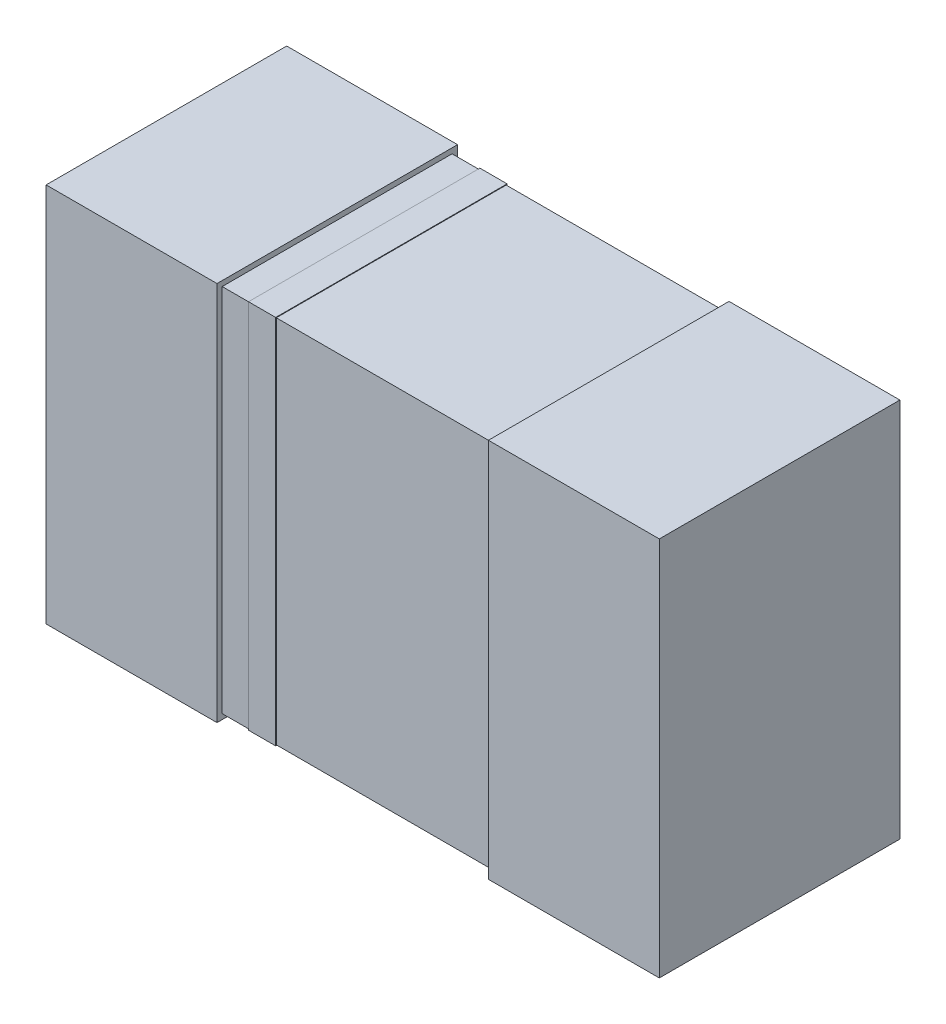
ISO-10303-21;
HEADER;
FILE_DESCRIPTION(('STEP AP214'),'2;1');
FILE_NAME('part.step','',(''),(''),'','','');
FILE_SCHEMA(('AUTOMOTIVE_DESIGN { 1 0 10303 214 1 1 1 1 }'));
ENDSEC;
DATA;
#1=APPLICATION_CONTEXT('core data for automotive mechanical design processes');
#2=APPLICATION_PROTOCOL_DEFINITION('international standard','automotive_design',2000,#1);
#3=PRODUCT_CONTEXT('',#1,'mechanical');
#4=PRODUCT('Part','Part','',(#3));
#5=PRODUCT_RELATED_PRODUCT_CATEGORY('part','',(#4));
#6=PRODUCT_DEFINITION_FORMATION('','',#4);
#7=PRODUCT_DEFINITION_CONTEXT('part definition',#1,'design');
#8=PRODUCT_DEFINITION('design','',#6,#7);
#9=PRODUCT_DEFINITION_SHAPE('','',#8);
#10=(LENGTH_UNIT() NAMED_UNIT(*) SI_UNIT(.MILLI.,.METRE.));
#11=(NAMED_UNIT(*) PLANE_ANGLE_UNIT() SI_UNIT($,.RADIAN.));
#12=(NAMED_UNIT(*) SI_UNIT($,.STERADIAN.) SOLID_ANGLE_UNIT());
#13=UNCERTAINTY_MEASURE_WITH_UNIT(LENGTH_MEASURE(1.E-05),#10,'distance_accuracy_value','');
#14=(GEOMETRIC_REPRESENTATION_CONTEXT(3) GLOBAL_UNCERTAINTY_ASSIGNED_CONTEXT((#13)) GLOBAL_UNIT_ASSIGNED_CONTEXT((#10,
#11,#12)) REPRESENTATION_CONTEXT('',''));
#15=CARTESIAN_POINT('',(0.,0.,0.));
#16=DIRECTION('',(0.,0.,1.));
#17=DIRECTION('',(1.,0.,0.));
#18=AXIS2_PLACEMENT_3D('',#15,#16,#17);
#19=CARTESIAN_POINT('',(0.444,0.622,0.));
#20=DIRECTION('',(-1.,0.,0.));
#21=DIRECTION('',(0.,0.,1.));
#22=AXIS2_PLACEMENT_3D('',#19,#20,#21);
#23=PLANE('',#22);
#24=DIRECTION('',(0.,1.,0.));
#25=VECTOR('',#24,1.);
#26=CARTESIAN_POINT('',(0.444,-0.622,0.787));
#27=LINE('',#26,#25);
#28=CARTESIAN_POINT('',(0.444,0.622,0.787));
#29=VERTEX_POINT('',#28);
#30=CARTESIAN_POINT('',(0.444,-0.622,0.787));
#31=VERTEX_POINT('',#30);
#32=EDGE_CURVE('P0_E68',#29,#31,#27,.F.);
#33=ORIENTED_EDGE('',*,*,#32,.F.);
#34=DIRECTION('',(0.,0.,1.));
#35=VECTOR('',#34,1.);
#36=CARTESIAN_POINT('',(0.444,0.622,0.));
#37=LINE('',#36,#35);
#38=CARTESIAN_POINT('',(0.444,0.622,0.));
#39=VERTEX_POINT('',#38);
#40=EDGE_CURVE('P0_E55',#39,#29,#37,.T.);
#41=ORIENTED_EDGE('',*,*,#40,.F.);
#42=DIRECTION('',(0.,1.,0.));
#43=VECTOR('',#42,1.);
#44=CARTESIAN_POINT('',(0.444,0.622,0.));
#45=LINE('',#44,#43);
#46=CARTESIAN_POINT('',(0.444,-0.622,0.));
#47=VERTEX_POINT('',#46);
#48=EDGE_CURVE('P0_E20',#47,#39,#45,.T.);
#49=ORIENTED_EDGE('',*,*,#48,.F.);
#50=DIRECTION('',(0.,0.,-1.));
#51=VECTOR('',#50,1.);
#52=CARTESIAN_POINT('',(0.444,-0.622,0.));
#53=LINE('',#52,#51);
#54=EDGE_CURVE('P0_E81',#31,#47,#53,.T.);
#55=ORIENTED_EDGE('',*,*,#54,.F.);
#56=EDGE_LOOP('',(#33,#41,#49,#55));
#57=FACE_BOUND('',#56,.T.);
#58=ADVANCED_FACE('P0_F17',(#57),#23,.T.);
#59=CARTESIAN_POINT('',(0.444,0.622,0.));
#60=DIRECTION('',(0.,0.,-1.));
#61=DIRECTION('',(-1.,0.,0.));
#62=AXIS2_PLACEMENT_3D('',#59,#60,#61);
#63=PLANE('',#62);
#64=DIRECTION('',(1.,0.,0.));
#65=VECTOR('',#64,1.);
#66=CARTESIAN_POINT('',(0.444,-0.622,0.));
#67=LINE('',#66,#65);
#68=CARTESIAN_POINT('',(1.003,-0.622,0.));
#69=VERTEX_POINT('',#68);
#70=EDGE_CURVE('P0_E64',#47,#69,#67,.T.);
#71=ORIENTED_EDGE('',*,*,#70,.F.);
#72=ORIENTED_EDGE('',*,*,#48,.T.);
#73=DIRECTION('',(1.,0.,0.));
#74=VECTOR('',#73,1.);
#75=CARTESIAN_POINT('',(1.003,0.622,0.));
#76=LINE('',#75,#74);
#77=CARTESIAN_POINT('',(1.003,0.622,0.));
#78=VERTEX_POINT('',#77);
#79=EDGE_CURVE('P0_E61',#78,#39,#76,.F.);
#80=ORIENTED_EDGE('',*,*,#79,.F.);
#81=DIRECTION('',(0.,1.,0.));
#82=VECTOR('',#81,1.);
#83=CARTESIAN_POINT('',(1.003,-0.622,0.));
#84=LINE('',#83,#82);
#85=EDGE_CURVE('P0_E83',#69,#78,#84,.T.);
#86=ORIENTED_EDGE('',*,*,#85,.F.);
#87=EDGE_LOOP('',(#71,#72,#80,#86));
#88=FACE_BOUND('',#87,.T.);
#89=ADVANCED_FACE('P0_F60',(#88),#63,.T.);
#90=CARTESIAN_POINT('',(1.003,0.622,0.));
#91=DIRECTION('',(0.,1.,0.));
#92=DIRECTION('',(0.,0.,1.));
#93=AXIS2_PLACEMENT_3D('',#90,#91,#92);
#94=PLANE('',#93);
#95=DIRECTION('',(1.,0.,0.));
#96=VECTOR('',#95,1.);
#97=CARTESIAN_POINT('',(0.444,0.622,0.787));
#98=LINE('',#97,#96);
#99=CARTESIAN_POINT('',(1.003,0.622,0.787));
#100=VERTEX_POINT('',#99);
#101=EDGE_CURVE('P0_E70',#100,#29,#98,.F.);
#102=ORIENTED_EDGE('',*,*,#101,.F.);
#103=DIRECTION('',(0.,0.,-1.));
#104=VECTOR('',#103,1.);
#105=CARTESIAN_POINT('',(1.003,0.622,0.));
#106=LINE('',#105,#104);
#107=EDGE_CURVE('P0_E74',#78,#100,#106,.F.);
#108=ORIENTED_EDGE('',*,*,#107,.F.);
#109=ORIENTED_EDGE('',*,*,#79,.T.);
#110=ORIENTED_EDGE('',*,*,#40,.T.);
#111=EDGE_LOOP('',(#102,#108,#109,#110));
#112=FACE_BOUND('',#111,.T.);
#113=ADVANCED_FACE('P0_F72',(#112),#94,.T.);
#114=CARTESIAN_POINT('',(0.444,-0.622,0.787));
#115=DIRECTION('',(0.,0.,1.));
#116=DIRECTION('',(1.,0.,0.));
#117=AXIS2_PLACEMENT_3D('',#114,#115,#116);
#118=PLANE('',#117);
#119=ORIENTED_EDGE('',*,*,#101,.T.);
#120=ORIENTED_EDGE('',*,*,#32,.T.);
#121=DIRECTION('',(1.,0.,0.));
#122=VECTOR('',#121,1.);
#123=CARTESIAN_POINT('',(0.444,-0.622,0.787));
#124=LINE('',#123,#122);
#125=CARTESIAN_POINT('',(1.003,-0.622,0.787));
#126=VERTEX_POINT('',#125);
#127=EDGE_CURVE('P0_E35',#126,#31,#124,.F.);
#128=ORIENTED_EDGE('',*,*,#127,.F.);
#129=DIRECTION('',(0.,1.,0.));
#130=VECTOR('',#129,1.);
#131=CARTESIAN_POINT('',(1.003,-0.622,0.787));
#132=LINE('',#131,#130);
#133=EDGE_CURVE('P0_E26',#100,#126,#132,.F.);
#134=ORIENTED_EDGE('',*,*,#133,.F.);
#135=EDGE_LOOP('',(#119,#120,#128,#134));
#136=FACE_BOUND('',#135,.T.);
#137=ADVANCED_FACE('P0_F89',(#136),#118,.T.);
#138=CARTESIAN_POINT('',(0.444,-0.622,0.));
#139=DIRECTION('',(0.,-1.,0.));
#140=DIRECTION('',(0.,0.,-1.));
#141=AXIS2_PLACEMENT_3D('',#138,#139,#140);
#142=PLANE('',#141);
#143=ORIENTED_EDGE('',*,*,#127,.T.);
#144=ORIENTED_EDGE('',*,*,#54,.T.);
#145=ORIENTED_EDGE('',*,*,#70,.T.);
#146=DIRECTION('',(0.,0.,-1.));
#147=VECTOR('',#146,1.);
#148=CARTESIAN_POINT('',(1.003,-0.622,0.));
#149=LINE('',#148,#147);
#150=EDGE_CURVE('P0_E11',#126,#69,#149,.T.);
#151=ORIENTED_EDGE('',*,*,#150,.F.);
#152=EDGE_LOOP('',(#143,#144,#145,#151));
#153=FACE_BOUND('',#152,.T.);
#154=ADVANCED_FACE('P0_F91',(#153),#142,.T.);
#155=CARTESIAN_POINT('',(1.003,-0.622,0.));
#156=DIRECTION('',(1.,0.,0.));
#157=DIRECTION('',(0.,0.,-1.));
#158=AXIS2_PLACEMENT_3D('',#155,#156,#157);
#159=PLANE('',#158);
#160=ORIENTED_EDGE('',*,*,#133,.T.);
#161=ORIENTED_EDGE('',*,*,#150,.T.);
#162=ORIENTED_EDGE('',*,*,#85,.T.);
#163=ORIENTED_EDGE('',*,*,#107,.T.);
#164=EDGE_LOOP('',(#160,#161,#162,#163));
#165=FACE_BOUND('',#164,.T.);
#166=ADVANCED_FACE('P0_F88',(#165),#159,.T.);
#167=CLOSED_SHELL('',(#58,#89,#113,#137,#154,#166));
#168=MANIFOLD_SOLID_BREP('P0_B1',#167);
#169=CARTESIAN_POINT('',(-0.267,-0.605,0.77));
#170=DIRECTION('',(0.,0.,-1.));
#171=DIRECTION('',(-1.,0.,0.));
#172=AXIS2_PLACEMENT_3D('',#169,#170,#171);
#173=PLANE('',#172);
#174=DIRECTION('',(1.,0.,0.));
#175=VECTOR('',#174,1.);
#176=CARTESIAN_POINT('',(-0.356,0.605,0.77));
#177=LINE('',#176,#175);
#178=CARTESIAN_POINT('',(-0.267,0.605,0.77));
#179=VERTEX_POINT('',#178);
#180=CARTESIAN_POINT('',(-0.356,0.605,0.77));
#181=VERTEX_POINT('',#180);
#182=EDGE_CURVE('P1_E92',#179,#181,#177,.F.);
#183=ORIENTED_EDGE('',*,*,#182,.F.);
#184=DIRECTION('',(0.,1.,0.));
#185=VECTOR('',#184,1.);
#186=CARTESIAN_POINT('',(-0.267,-0.607,0.77));
#187=LINE('',#186,#185);
#188=CARTESIAN_POINT('',(-0.267,-0.605,0.77));
#189=VERTEX_POINT('',#188);
#190=EDGE_CURVE('P1_E90',#189,#179,#187,.T.);
#191=ORIENTED_EDGE('',*,*,#190,.F.);
#192=DIRECTION('',(1.,0.,0.));
#193=VECTOR('',#192,1.);
#194=CARTESIAN_POINT('',(-0.267,-0.605,0.77));
#195=LINE('',#194,#193);
#196=CARTESIAN_POINT('',(-0.356,-0.605,0.77));
#197=VERTEX_POINT('',#196);
#198=EDGE_CURVE('P1_E20',#197,#189,#195,.T.);
#199=ORIENTED_EDGE('',*,*,#198,.F.);
#200=DIRECTION('',(0.,1.,0.));
#201=VECTOR('',#200,1.);
#202=CARTESIAN_POINT('',(-0.356,-0.605,0.77));
#203=LINE('',#202,#201);
#204=EDGE_CURVE('P1_E113',#181,#197,#203,.F.);
#205=ORIENTED_EDGE('',*,*,#204,.F.);
#206=EDGE_LOOP('',(#183,#191,#199,#205));
#207=FACE_BOUND('',#206,.T.);
#208=ADVANCED_FACE('P1_F17',(#207),#173,.T.);
#209=CARTESIAN_POINT('',(-0.267,-0.605,0.018));
#210=DIRECTION('',(0.,1.,0.));
#211=DIRECTION('',(0.,0.,1.));
#212=AXIS2_PLACEMENT_3D('',#209,#210,#211);
#213=PLANE('',#212);
#214=ORIENTED_EDGE('',*,*,#198,.T.);
#215=DIRECTION('',(0.,0.,-1.));
#216=VECTOR('',#215,1.);
#217=CARTESIAN_POINT('',(-0.267,-0.605,0.015));
#218=LINE('',#217,#216);
#219=CARTESIAN_POINT('',(-0.267,-0.605,0.018));
#220=VERTEX_POINT('',#219);
#221=EDGE_CURVE('P1_E84',#220,#189,#218,.F.);
#222=ORIENTED_EDGE('',*,*,#221,.F.);
#223=DIRECTION('',(1.,0.,0.));
#224=VECTOR('',#223,1.);
#225=CARTESIAN_POINT('',(-0.356,-0.605,0.018));
#226=LINE('',#225,#224);
#227=CARTESIAN_POINT('',(-0.356,-0.605,0.018));
#228=VERTEX_POINT('',#227);
#229=EDGE_CURVE('P1_E105',#228,#220,#226,.T.);
#230=ORIENTED_EDGE('',*,*,#229,.F.);
#231=DIRECTION('',(0.,0.,1.));
#232=VECTOR('',#231,1.);
#233=CARTESIAN_POINT('',(-0.356,-0.605,0.018));
#234=LINE('',#233,#232);
#235=EDGE_CURVE('P1_E87',#197,#228,#234,.F.);
#236=ORIENTED_EDGE('',*,*,#235,.F.);
#237=EDGE_LOOP('',(#214,#222,#230,#236));
#238=FACE_BOUND('',#237,.T.);
#239=ADVANCED_FACE('P1_F82',(#238),#213,.T.);
#240=CARTESIAN_POINT('',(-0.356,-0.607,0.772));
#241=DIRECTION('',(0.,0.,1.));
#242=DIRECTION('',(1.,0.,0.));
#243=AXIS2_PLACEMENT_3D('',#240,#241,#242);
#244=PLANE('',#243);
#245=DIRECTION('',(1.,0.,0.));
#246=VECTOR('',#245,1.);
#247=CARTESIAN_POINT('',(-0.267,0.607,0.772));
#248=LINE('',#247,#246);
#249=CARTESIAN_POINT('',(-0.356,0.607,0.772));
#250=VERTEX_POINT('',#249);
#251=CARTESIAN_POINT('',(-0.267,0.607,0.772));
#252=VERTEX_POINT('',#251);
#253=EDGE_CURVE('P1_E116',#250,#252,#248,.T.);
#254=ORIENTED_EDGE('',*,*,#253,.F.);
#255=DIRECTION('',(0.,1.,0.));
#256=VECTOR('',#255,1.);
#257=CARTESIAN_POINT('',(-0.356,-0.605,0.772));
#258=LINE('',#257,#256);
#259=CARTESIAN_POINT('',(-0.356,-0.607,0.772));
#260=VERTEX_POINT('',#259);
#261=EDGE_CURVE('P1_E110',#260,#250,#258,.T.);
#262=ORIENTED_EDGE('',*,*,#261,.F.);
#263=DIRECTION('',(1.,0.,0.));
#264=VECTOR('',#263,1.);
#265=CARTESIAN_POINT('',(-0.356,-0.607,0.772));
#266=LINE('',#265,#264);
#267=CARTESIAN_POINT('',(-0.267,-0.607,0.772));
#268=VERTEX_POINT('',#267);
#269=EDGE_CURVE('P1_E128',#268,#260,#266,.F.);
#270=ORIENTED_EDGE('',*,*,#269,.F.);
#271=DIRECTION('',(0.,1.,0.));
#272=VECTOR('',#271,1.);
#273=CARTESIAN_POINT('',(-0.267,-0.607,0.772));
#274=LINE('',#273,#272);
#275=EDGE_CURVE('P1_E96',#268,#252,#274,.T.);
#276=ORIENTED_EDGE('',*,*,#275,.T.);
#277=EDGE_LOOP('',(#254,#262,#270,#276));
#278=FACE_BOUND('',#277,.T.);
#279=ADVANCED_FACE('P1_F153',(#278),#244,.T.);
#280=CARTESIAN_POINT('',(-0.356,-0.605,0.018));
#281=DIRECTION('',(0.,0.,1.));
#282=DIRECTION('',(1.,0.,0.));
#283=AXIS2_PLACEMENT_3D('',#280,#281,#282);
#284=PLANE('',#283);
#285=DIRECTION('',(1.,0.,0.));
#286=VECTOR('',#285,1.);
#287=CARTESIAN_POINT('',(-0.356,0.605,0.018));
#288=LINE('',#287,#286);
#289=CARTESIAN_POINT('',(-0.356,0.605,0.018));
#290=VERTEX_POINT('',#289);
#291=CARTESIAN_POINT('',(-0.267,0.605,0.018));
#292=VERTEX_POINT('',#291);
#293=EDGE_CURVE('P1_E107',#290,#292,#288,.T.);
#294=ORIENTED_EDGE('',*,*,#293,.F.);
#295=DIRECTION('',(0.,1.,0.));
#296=VECTOR('',#295,1.);
#297=CARTESIAN_POINT('',(-0.356,0.607,0.018));
#298=LINE('',#297,#296);
#299=EDGE_CURVE('P1_E131',#228,#290,#298,.T.);
#300=ORIENTED_EDGE('',*,*,#299,.F.);
#301=ORIENTED_EDGE('',*,*,#229,.T.);
#302=DIRECTION('',(0.,1.,0.));
#303=VECTOR('',#302,1.);
#304=CARTESIAN_POINT('',(-0.267,-0.607,0.018));
#305=LINE('',#304,#303);
#306=EDGE_CURVE('P1_E102',#292,#220,#305,.F.);
#307=ORIENTED_EDGE('',*,*,#306,.F.);
#308=EDGE_LOOP('',(#294,#300,#301,#307));
#309=FACE_BOUND('',#308,.T.);
#310=ADVANCED_FACE('P1_F168',(#309),#284,.T.);
#311=CARTESIAN_POINT('',(-0.356,0.605,0.018));
#312=DIRECTION('',(0.,-1.,0.));
#313=DIRECTION('',(0.,0.,-1.));
#314=AXIS2_PLACEMENT_3D('',#311,#312,#313);
#315=PLANE('',#314);
#316=ORIENTED_EDGE('',*,*,#182,.T.);
#317=DIRECTION('',(0.,0.,1.));
#318=VECTOR('',#317,1.);
#319=CARTESIAN_POINT('',(-0.356,0.605,0.015));
#320=LINE('',#319,#318);
#321=EDGE_CURVE('P1_E134',#290,#181,#320,.T.);
#322=ORIENTED_EDGE('',*,*,#321,.F.);
#323=ORIENTED_EDGE('',*,*,#293,.T.);
#324=DIRECTION('',(0.,0.,-1.));
#325=VECTOR('',#324,1.);
#326=CARTESIAN_POINT('',(-0.267,0.605,0.015));
#327=LINE('',#326,#325);
#328=EDGE_CURVE('P1_E122',#179,#292,#327,.T.);
#329=ORIENTED_EDGE('',*,*,#328,.F.);
#330=EDGE_LOOP('',(#316,#322,#323,#329));
#331=FACE_BOUND('',#330,.T.);
#332=ADVANCED_FACE('P1_F160',(#331),#315,.T.);
#333=CARTESIAN_POINT('',(-0.267,0.607,0.015));
#334=DIRECTION('',(0.,1.,0.));
#335=DIRECTION('',(0.,0.,1.));
#336=AXIS2_PLACEMENT_3D('',#333,#334,#335);
#337=PLANE('',#336);
#338=ORIENTED_EDGE('',*,*,#253,.T.);
#339=DIRECTION('',(0.,0.,-1.));
#340=VECTOR('',#339,1.);
#341=CARTESIAN_POINT('',(-0.267,0.607,0.015));
#342=LINE('',#341,#340);
#343=CARTESIAN_POINT('',(-0.267,0.607,0.015));
#344=VERTEX_POINT('',#343);
#345=EDGE_CURVE('P1_E119',#344,#252,#342,.F.);
#346=ORIENTED_EDGE('',*,*,#345,.F.);
#347=DIRECTION('',(-1.,0.,0.));
#348=VECTOR('',#347,1.);
#349=CARTESIAN_POINT('',(-0.356,0.607,0.015));
#350=LINE('',#349,#348);
#351=CARTESIAN_POINT('',(-0.356,0.607,0.015));
#352=VERTEX_POINT('',#351);
#353=EDGE_CURVE('P1_E140',#352,#344,#350,.F.);
#354=ORIENTED_EDGE('',*,*,#353,.F.);
#355=DIRECTION('',(0.,0.,1.));
#356=VECTOR('',#355,1.);
#357=CARTESIAN_POINT('',(-0.356,0.607,0.015));
#358=LINE('',#357,#356);
#359=EDGE_CURVE('P1_E137',#250,#352,#358,.F.);
#360=ORIENTED_EDGE('',*,*,#359,.F.);
#361=EDGE_LOOP('',(#338,#346,#354,#360));
#362=FACE_BOUND('',#361,.T.);
#363=ADVANCED_FACE('P1_F158',(#362),#337,.T.);
#364=CARTESIAN_POINT('',(-0.267,-0.607,0.015));
#365=DIRECTION('',(1.,0.,0.));
#366=DIRECTION('',(0.,0.,-1.));
#367=AXIS2_PLACEMENT_3D('',#364,#365,#366);
#368=PLANE('',#367);
#369=ORIENTED_EDGE('',*,*,#190,.T.);
#370=ORIENTED_EDGE('',*,*,#328,.T.);
#371=ORIENTED_EDGE('',*,*,#306,.T.);
#372=ORIENTED_EDGE('',*,*,#221,.T.);
#373=EDGE_LOOP('',(#369,#370,#371,#372));
#374=FACE_BOUND('',#373,.T.);
#375=ORIENTED_EDGE('',*,*,#345,.T.);
#376=ORIENTED_EDGE('',*,*,#275,.F.);
#377=DIRECTION('',(0.,0.,-1.));
#378=VECTOR('',#377,1.);
#379=CARTESIAN_POINT('',(-0.267,-0.607,0.015));
#380=LINE('',#379,#378);
#381=CARTESIAN_POINT('',(-0.267,-0.607,0.015));
#382=VERTEX_POINT('',#381);
#383=EDGE_CURVE('P1_E125',#382,#268,#380,.F.);
#384=ORIENTED_EDGE('',*,*,#383,.F.);
#385=DIRECTION('',(0.,1.,0.));
#386=VECTOR('',#385,1.);
#387=CARTESIAN_POINT('',(-0.267,0.607,0.015));
#388=LINE('',#387,#386);
#389=EDGE_CURVE('P1_E143',#344,#382,#388,.F.);
#390=ORIENTED_EDGE('',*,*,#389,.F.);
#391=EDGE_LOOP('',(#375,#376,#384,#390));
#392=FACE_BOUND('',#391,.T.);
#393=ADVANCED_FACE('P1_F99',(#374,#392),#368,.T.);
#394=CARTESIAN_POINT('',(-0.356,-0.607,0.015));
#395=DIRECTION('',(0.,-1.,0.));
#396=DIRECTION('',(0.,0.,-1.));
#397=AXIS2_PLACEMENT_3D('',#394,#395,#396);
#398=PLANE('',#397);
#399=ORIENTED_EDGE('',*,*,#269,.T.);
#400=DIRECTION('',(0.,0.,-1.));
#401=VECTOR('',#400,1.);
#402=CARTESIAN_POINT('',(-0.356,-0.607,0.015));
#403=LINE('',#402,#401);
#404=CARTESIAN_POINT('',(-0.356,-0.607,0.015));
#405=VERTEX_POINT('',#404);
#406=EDGE_CURVE('P1_E35',#260,#405,#403,.T.);
#407=ORIENTED_EDGE('',*,*,#406,.T.);
#408=DIRECTION('',(-1.,0.,0.));
#409=VECTOR('',#408,1.);
#410=CARTESIAN_POINT('',(-0.356,-0.607,0.015));
#411=LINE('',#410,#409);
#412=EDGE_CURVE('P1_E26',#382,#405,#411,.T.);
#413=ORIENTED_EDGE('',*,*,#412,.F.);
#414=ORIENTED_EDGE('',*,*,#383,.T.);
#415=EDGE_LOOP('',(#399,#407,#413,#414));
#416=FACE_BOUND('',#415,.T.);
#417=ADVANCED_FACE('P1_F150',(#416),#398,.T.);
#418=CARTESIAN_POINT('',(-0.356,0.607,0.015));
#419=DIRECTION('',(-1.,0.,0.));
#420=DIRECTION('',(0.,0.,1.));
#421=AXIS2_PLACEMENT_3D('',#418,#419,#420);
#422=PLANE('',#421);
#423=ORIENTED_EDGE('',*,*,#235,.T.);
#424=ORIENTED_EDGE('',*,*,#299,.T.);
#425=ORIENTED_EDGE('',*,*,#321,.T.);
#426=ORIENTED_EDGE('',*,*,#204,.T.);
#427=EDGE_LOOP('',(#423,#424,#425,#426));
#428=FACE_BOUND('',#427,.T.);
#429=DIRECTION('',(0.,1.,0.));
#430=VECTOR('',#429,1.);
#431=CARTESIAN_POINT('',(-0.356,0.607,0.015));
#432=LINE('',#431,#430);
#433=EDGE_CURVE('P1_E11',#405,#352,#432,.T.);
#434=ORIENTED_EDGE('',*,*,#433,.F.);
#435=ORIENTED_EDGE('',*,*,#406,.F.);
#436=ORIENTED_EDGE('',*,*,#261,.T.);
#437=ORIENTED_EDGE('',*,*,#359,.T.);
#438=EDGE_LOOP('',(#434,#435,#436,#437));
#439=FACE_BOUND('',#438,.T.);
#440=ADVANCED_FACE('P1_F156',(#428,#439),#422,.T.);
#441=CARTESIAN_POINT('',(-0.356,0.607,0.015));
#442=DIRECTION('',(0.,0.,-1.));
#443=DIRECTION('',(-1.,0.,0.));
#444=AXIS2_PLACEMENT_3D('',#441,#442,#443);
#445=PLANE('',#444);
#446=ORIENTED_EDGE('',*,*,#412,.T.);
#447=ORIENTED_EDGE('',*,*,#433,.T.);
#448=ORIENTED_EDGE('',*,*,#353,.T.);
#449=ORIENTED_EDGE('',*,*,#389,.T.);
#450=EDGE_LOOP('',(#446,#447,#448,#449));
#451=FACE_BOUND('',#450,.T.);
#452=ADVANCED_FACE('P1_F148',(#451),#445,.T.);
#453=CLOSED_SHELL('',(#208,#239,#279,#310,#332,#363,#393,#417,#440,#452));
#454=MANIFOLD_SOLID_BREP('P1_B1',#453);
#455=CARTESIAN_POINT('',(-0.444,-0.605,0.77));
#456=DIRECTION('',(0.,0.,1.));
#457=DIRECTION('',(1.,0.,0.));
#458=AXIS2_PLACEMENT_3D('',#455,#456,#457);
#459=PLANE('',#458);
#460=DIRECTION('',(1.,0.,0.));
#461=VECTOR('',#460,1.);
#462=CARTESIAN_POINT('',(0.444,0.605,0.77));
#463=LINE('',#462,#461);
#464=CARTESIAN_POINT('',(-0.444,0.605,0.77));
#465=VERTEX_POINT('',#464);
#466=CARTESIAN_POINT('',(0.444,0.605,0.77));
#467=VERTEX_POINT('',#466);
#468=EDGE_CURVE('P2_E20',#465,#467,#463,.T.);
#469=ORIENTED_EDGE('',*,*,#468,.F.);
#470=DIRECTION('',(0.,1.,0.));
#471=VECTOR('',#470,1.);
#472=CARTESIAN_POINT('',(-0.444,0.605,0.77));
#473=LINE('',#472,#471);
#474=CARTESIAN_POINT('',(-0.444,-0.605,0.77));
#475=VERTEX_POINT('',#474);
#476=EDGE_CURVE('P2_E80',#475,#465,#473,.T.);
#477=ORIENTED_EDGE('',*,*,#476,.F.);
#478=DIRECTION('',(1.,0.,0.));
#479=VECTOR('',#478,1.);
#480=CARTESIAN_POINT('',(-0.444,-0.605,0.77));
#481=LINE('',#480,#479);
#482=CARTESIAN_POINT('',(0.444,-0.605,0.77));
#483=VERTEX_POINT('',#482);
#484=EDGE_CURVE('P2_E68',#483,#475,#481,.F.);
#485=ORIENTED_EDGE('',*,*,#484,.F.);
#486=DIRECTION('',(0.,1.,0.));
#487=VECTOR('',#486,1.);
#488=CARTESIAN_POINT('',(0.444,-0.605,0.77));
#489=LINE('',#488,#487);
#490=EDGE_CURVE('P2_E55',#467,#483,#489,.F.);
#491=ORIENTED_EDGE('',*,*,#490,.F.);
#492=EDGE_LOOP('',(#469,#477,#485,#491));
#493=FACE_BOUND('',#492,.T.);
#494=ADVANCED_FACE('P2_F17',(#493),#459,.T.);
#495=CARTESIAN_POINT('',(0.444,0.605,0.018));
#496=DIRECTION('',(0.,1.,0.));
#497=DIRECTION('',(0.,0.,1.));
#498=AXIS2_PLACEMENT_3D('',#495,#496,#497);
#499=PLANE('',#498);
#500=ORIENTED_EDGE('',*,*,#468,.T.);
#501=DIRECTION('',(0.,0.,-1.));
#502=VECTOR('',#501,1.);
#503=CARTESIAN_POINT('',(0.444,0.605,0.018));
#504=LINE('',#503,#502);
#505=CARTESIAN_POINT('',(0.444,0.605,0.018));
#506=VERTEX_POINT('',#505);
#507=EDGE_CURVE('P2_E61',#506,#467,#504,.F.);
#508=ORIENTED_EDGE('',*,*,#507,.F.);
#509=DIRECTION('',(-1.,0.,0.));
#510=VECTOR('',#509,1.);
#511=CARTESIAN_POINT('',(-0.444,0.605,0.018));
#512=LINE('',#511,#510);
#513=CARTESIAN_POINT('',(-0.444,0.605,0.018));
#514=VERTEX_POINT('',#513);
#515=EDGE_CURVE('P2_E83',#514,#506,#512,.F.);
#516=ORIENTED_EDGE('',*,*,#515,.F.);
#517=DIRECTION('',(0.,0.,1.));
#518=VECTOR('',#517,1.);
#519=CARTESIAN_POINT('',(-0.444,0.605,0.018));
#520=LINE('',#519,#518);
#521=EDGE_CURVE('P2_E64',#465,#514,#520,.F.);
#522=ORIENTED_EDGE('',*,*,#521,.F.);
#523=EDGE_LOOP('',(#500,#508,#516,#522));
#524=FACE_BOUND('',#523,.T.);
#525=ADVANCED_FACE('P2_F60',(#524),#499,.T.);
#526=CARTESIAN_POINT('',(0.444,-0.605,0.018));
#527=DIRECTION('',(1.,0.,0.));
#528=DIRECTION('',(0.,0.,-1.));
#529=AXIS2_PLACEMENT_3D('',#526,#527,#528);
#530=PLANE('',#529);
#531=ORIENTED_EDGE('',*,*,#490,.T.);
#532=DIRECTION('',(0.,0.,-1.));
#533=VECTOR('',#532,1.);
#534=CARTESIAN_POINT('',(0.444,-0.605,0.018));
#535=LINE('',#534,#533);
#536=CARTESIAN_POINT('',(0.444,-0.605,0.018));
#537=VERTEX_POINT('',#536);
#538=EDGE_CURVE('P2_E70',#537,#483,#535,.F.);
#539=ORIENTED_EDGE('',*,*,#538,.F.);
#540=DIRECTION('',(0.,1.,0.));
#541=VECTOR('',#540,1.);
#542=CARTESIAN_POINT('',(0.444,0.605,0.018));
#543=LINE('',#542,#541);
#544=EDGE_CURVE('P2_E74',#506,#537,#543,.F.);
#545=ORIENTED_EDGE('',*,*,#544,.F.);
#546=ORIENTED_EDGE('',*,*,#507,.T.);
#547=EDGE_LOOP('',(#531,#539,#545,#546));
#548=FACE_BOUND('',#547,.T.);
#549=ADVANCED_FACE('P2_F72',(#548),#530,.T.);
#550=CARTESIAN_POINT('',(-0.444,-0.605,0.018));
#551=DIRECTION('',(0.,-1.,0.));
#552=DIRECTION('',(0.,0.,-1.));
#553=AXIS2_PLACEMENT_3D('',#550,#551,#552);
#554=PLANE('',#553);
#555=ORIENTED_EDGE('',*,*,#484,.T.);
#556=DIRECTION('',(0.,0.,1.));
#557=VECTOR('',#556,1.);
#558=CARTESIAN_POINT('',(-0.444,-0.605,0.018));
#559=LINE('',#558,#557);
#560=CARTESIAN_POINT('',(-0.444,-0.605,0.018));
#561=VERTEX_POINT('',#560);
#562=EDGE_CURVE('P2_E35',#561,#475,#559,.T.);
#563=ORIENTED_EDGE('',*,*,#562,.F.);
#564=DIRECTION('',(-1.,0.,0.));
#565=VECTOR('',#564,1.);
#566=CARTESIAN_POINT('',(-0.444,-0.605,0.018));
#567=LINE('',#566,#565);
#568=EDGE_CURVE('P2_E26',#537,#561,#567,.T.);
#569=ORIENTED_EDGE('',*,*,#568,.F.);
#570=ORIENTED_EDGE('',*,*,#538,.T.);
#571=EDGE_LOOP('',(#555,#563,#569,#570));
#572=FACE_BOUND('',#571,.T.);
#573=ADVANCED_FACE('P2_F89',(#572),#554,.T.);
#574=CARTESIAN_POINT('',(-0.444,0.605,0.018));
#575=DIRECTION('',(-1.,0.,0.));
#576=DIRECTION('',(0.,0.,1.));
#577=AXIS2_PLACEMENT_3D('',#574,#575,#576);
#578=PLANE('',#577);
#579=ORIENTED_EDGE('',*,*,#476,.T.);
#580=ORIENTED_EDGE('',*,*,#521,.T.);
#581=DIRECTION('',(0.,1.,0.));
#582=VECTOR('',#581,1.);
#583=CARTESIAN_POINT('',(-0.444,0.605,0.018));
#584=LINE('',#583,#582);
#585=EDGE_CURVE('P2_E11',#561,#514,#584,.T.);
#586=ORIENTED_EDGE('',*,*,#585,.F.);
#587=ORIENTED_EDGE('',*,*,#562,.T.);
#588=EDGE_LOOP('',(#579,#580,#586,#587));
#589=FACE_BOUND('',#588,.T.);
#590=ADVANCED_FACE('P2_F91',(#589),#578,.T.);
#591=CARTESIAN_POINT('',(-0.444,0.605,0.018));
#592=DIRECTION('',(0.,0.,-1.));
#593=DIRECTION('',(-1.,0.,0.));
#594=AXIS2_PLACEMENT_3D('',#591,#592,#593);
#595=PLANE('',#594);
#596=ORIENTED_EDGE('',*,*,#568,.T.);
#597=ORIENTED_EDGE('',*,*,#585,.T.);
#598=ORIENTED_EDGE('',*,*,#515,.T.);
#599=ORIENTED_EDGE('',*,*,#544,.T.);
#600=EDGE_LOOP('',(#596,#597,#598,#599));
#601=FACE_BOUND('',#600,.T.);
#602=ADVANCED_FACE('P2_F88',(#601),#595,.T.);
#603=CLOSED_SHELL('',(#494,#525,#549,#573,#590,#602));
#604=MANIFOLD_SOLID_BREP('P2_B1',#603);
#605=CARTESIAN_POINT('',(-1.003,0.622,0.));
#606=DIRECTION('',(-1.,0.,0.));
#607=DIRECTION('',(0.,0.,1.));
#608=AXIS2_PLACEMENT_3D('',#605,#606,#607);
#609=PLANE('',#608);
#610=DIRECTION('',(0.,1.,0.));
#611=VECTOR('',#610,1.);
#612=CARTESIAN_POINT('',(-1.003,-0.622,0.787));
#613=LINE('',#612,#611);
#614=CARTESIAN_POINT('',(-1.003,0.622,0.787));
#615=VERTEX_POINT('',#614);
#616=CARTESIAN_POINT('',(-1.003,-0.622,0.787));
#617=VERTEX_POINT('',#616);
#618=EDGE_CURVE('P3_E68',#615,#617,#613,.F.);
#619=ORIENTED_EDGE('',*,*,#618,.F.);
#620=DIRECTION('',(0.,0.,1.));
#621=VECTOR('',#620,1.);
#622=CARTESIAN_POINT('',(-1.003,0.622,0.));
#623=LINE('',#622,#621);
#624=CARTESIAN_POINT('',(-1.003,0.622,0.));
#625=VERTEX_POINT('',#624);
#626=EDGE_CURVE('P3_E55',#625,#615,#623,.T.);
#627=ORIENTED_EDGE('',*,*,#626,.F.);
#628=DIRECTION('',(0.,1.,0.));
#629=VECTOR('',#628,1.);
#630=CARTESIAN_POINT('',(-1.003,0.622,0.));
#631=LINE('',#630,#629);
#632=CARTESIAN_POINT('',(-1.003,-0.622,0.));
#633=VERTEX_POINT('',#632);
#634=EDGE_CURVE('P3_E20',#633,#625,#631,.T.);
#635=ORIENTED_EDGE('',*,*,#634,.F.);
#636=DIRECTION('',(0.,0.,-1.));
#637=VECTOR('',#636,1.);
#638=CARTESIAN_POINT('',(-1.003,-0.622,0.));
#639=LINE('',#638,#637);
#640=EDGE_CURVE('P3_E81',#617,#633,#639,.T.);
#641=ORIENTED_EDGE('',*,*,#640,.F.);
#642=EDGE_LOOP('',(#619,#627,#635,#641));
#643=FACE_BOUND('',#642,.T.);
#644=ADVANCED_FACE('P3_F17',(#643),#609,.T.);
#645=CARTESIAN_POINT('',(-1.003,0.622,0.));
#646=DIRECTION('',(0.,0.,-1.));
#647=DIRECTION('',(-1.,0.,0.));
#648=AXIS2_PLACEMENT_3D('',#645,#646,#647);
#649=PLANE('',#648);
#650=DIRECTION('',(1.,0.,0.));
#651=VECTOR('',#650,1.);
#652=CARTESIAN_POINT('',(-1.003,-0.622,0.));
#653=LINE('',#652,#651);
#654=CARTESIAN_POINT('',(-0.444,-0.622,0.));
#655=VERTEX_POINT('',#654);
#656=EDGE_CURVE('P3_E64',#633,#655,#653,.T.);
#657=ORIENTED_EDGE('',*,*,#656,.F.);
#658=ORIENTED_EDGE('',*,*,#634,.T.);
#659=DIRECTION('',(1.,0.,0.));
#660=VECTOR('',#659,1.);
#661=CARTESIAN_POINT('',(-0.444,0.622,0.));
#662=LINE('',#661,#660);
#663=CARTESIAN_POINT('',(-0.444,0.622,0.));
#664=VERTEX_POINT('',#663);
#665=EDGE_CURVE('P3_E61',#664,#625,#662,.F.);
#666=ORIENTED_EDGE('',*,*,#665,.F.);
#667=DIRECTION('',(0.,1.,0.));
#668=VECTOR('',#667,1.);
#669=CARTESIAN_POINT('',(-0.444,-0.622,0.));
#670=LINE('',#669,#668);
#671=EDGE_CURVE('P3_E83',#655,#664,#670,.T.);
#672=ORIENTED_EDGE('',*,*,#671,.F.);
#673=EDGE_LOOP('',(#657,#658,#666,#672));
#674=FACE_BOUND('',#673,.T.);
#675=ADVANCED_FACE('P3_F60',(#674),#649,.T.);
#676=CARTESIAN_POINT('',(-0.444,0.622,0.));
#677=DIRECTION('',(0.,1.,0.));
#678=DIRECTION('',(0.,0.,1.));
#679=AXIS2_PLACEMENT_3D('',#676,#677,#678);
#680=PLANE('',#679);
#681=DIRECTION('',(1.,0.,0.));
#682=VECTOR('',#681,1.);
#683=CARTESIAN_POINT('',(-1.003,0.622,0.787));
#684=LINE('',#683,#682);
#685=CARTESIAN_POINT('',(-0.444,0.622,0.787));
#686=VERTEX_POINT('',#685);
#687=EDGE_CURVE('P3_E70',#686,#615,#684,.F.);
#688=ORIENTED_EDGE('',*,*,#687,.F.);
#689=DIRECTION('',(0.,0.,-1.));
#690=VECTOR('',#689,1.);
#691=CARTESIAN_POINT('',(-0.444,0.622,0.));
#692=LINE('',#691,#690);
#693=EDGE_CURVE('P3_E74',#664,#686,#692,.F.);
#694=ORIENTED_EDGE('',*,*,#693,.F.);
#695=ORIENTED_EDGE('',*,*,#665,.T.);
#696=ORIENTED_EDGE('',*,*,#626,.T.);
#697=EDGE_LOOP('',(#688,#694,#695,#696));
#698=FACE_BOUND('',#697,.T.);
#699=ADVANCED_FACE('P3_F72',(#698),#680,.T.);
#700=CARTESIAN_POINT('',(-1.003,-0.622,0.787));
#701=DIRECTION('',(0.,0.,1.));
#702=DIRECTION('',(1.,0.,0.));
#703=AXIS2_PLACEMENT_3D('',#700,#701,#702);
#704=PLANE('',#703);
#705=ORIENTED_EDGE('',*,*,#687,.T.);
#706=ORIENTED_EDGE('',*,*,#618,.T.);
#707=DIRECTION('',(1.,0.,0.));
#708=VECTOR('',#707,1.);
#709=CARTESIAN_POINT('',(-1.003,-0.622,0.787));
#710=LINE('',#709,#708);
#711=CARTESIAN_POINT('',(-0.444,-0.622,0.787));
#712=VERTEX_POINT('',#711);
#713=EDGE_CURVE('P3_E35',#712,#617,#710,.F.);
#714=ORIENTED_EDGE('',*,*,#713,.F.);
#715=DIRECTION('',(0.,1.,0.));
#716=VECTOR('',#715,1.);
#717=CARTESIAN_POINT('',(-0.444,-0.622,0.787));
#718=LINE('',#717,#716);
#719=EDGE_CURVE('P3_E26',#686,#712,#718,.F.);
#720=ORIENTED_EDGE('',*,*,#719,.F.);
#721=EDGE_LOOP('',(#705,#706,#714,#720));
#722=FACE_BOUND('',#721,.T.);
#723=ADVANCED_FACE('P3_F89',(#722),#704,.T.);
#724=CARTESIAN_POINT('',(-1.003,-0.622,0.));
#725=DIRECTION('',(0.,-1.,0.));
#726=DIRECTION('',(0.,0.,-1.));
#727=AXIS2_PLACEMENT_3D('',#724,#725,#726);
#728=PLANE('',#727);
#729=ORIENTED_EDGE('',*,*,#713,.T.);
#730=ORIENTED_EDGE('',*,*,#640,.T.);
#731=ORIENTED_EDGE('',*,*,#656,.T.);
#732=DIRECTION('',(0.,0.,-1.));
#733=VECTOR('',#732,1.);
#734=CARTESIAN_POINT('',(-0.444,-0.622,0.));
#735=LINE('',#734,#733);
#736=EDGE_CURVE('P3_E11',#712,#655,#735,.T.);
#737=ORIENTED_EDGE('',*,*,#736,.F.);
#738=EDGE_LOOP('',(#729,#730,#731,#737));
#739=FACE_BOUND('',#738,.T.);
#740=ADVANCED_FACE('P3_F91',(#739),#728,.T.);
#741=CARTESIAN_POINT('',(-0.444,-0.622,0.));
#742=DIRECTION('',(1.,0.,0.));
#743=DIRECTION('',(0.,0.,-1.));
#744=AXIS2_PLACEMENT_3D('',#741,#742,#743);
#745=PLANE('',#744);
#746=ORIENTED_EDGE('',*,*,#719,.T.);
#747=ORIENTED_EDGE('',*,*,#736,.T.);
#748=ORIENTED_EDGE('',*,*,#671,.T.);
#749=ORIENTED_EDGE('',*,*,#693,.T.);
#750=EDGE_LOOP('',(#746,#747,#748,#749));
#751=FACE_BOUND('',#750,.T.);
#752=ADVANCED_FACE('P3_F88',(#751),#745,.T.);
#753=CLOSED_SHELL('',(#644,#675,#699,#723,#740,#752));
#754=MANIFOLD_SOLID_BREP('P3_B1',#753);
#755=ADVANCED_BREP_SHAPE_REPRESENTATION('',(#18,#168,#454,#604,#754),#14);
#756=SHAPE_DEFINITION_REPRESENTATION(#9,#755);
ENDSEC;
END-ISO-10303-21;
